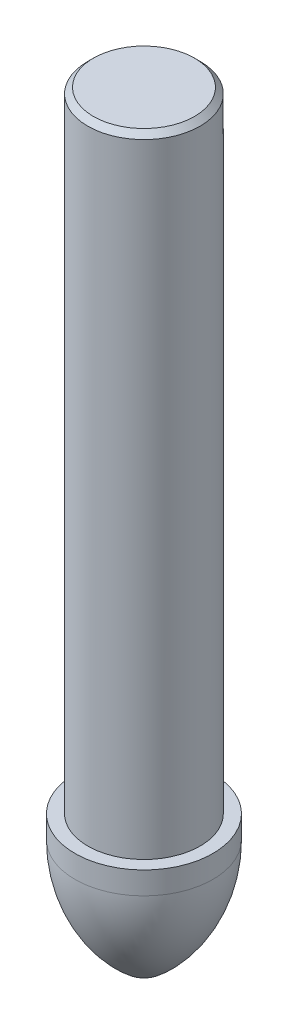
ISO-10303-21;
HEADER;
FILE_DESCRIPTION(('STEP AP214'),'2;1');
FILE_NAME('part.step','',(''),(''),'','','');
FILE_SCHEMA(('AUTOMOTIVE_DESIGN { 1 0 10303 214 1 1 1 1 }'));
ENDSEC;
DATA;
#1=APPLICATION_CONTEXT('core data for automotive mechanical design processes');
#2=APPLICATION_PROTOCOL_DEFINITION('international standard','automotive_design',2000,#1);
#3=PRODUCT_CONTEXT('',#1,'mechanical');
#4=PRODUCT('Part','Part','',(#3));
#5=PRODUCT_RELATED_PRODUCT_CATEGORY('part','',(#4));
#6=PRODUCT_DEFINITION_FORMATION('','',#4);
#7=PRODUCT_DEFINITION_CONTEXT('part definition',#1,'design');
#8=PRODUCT_DEFINITION('design','',#6,#7);
#9=PRODUCT_DEFINITION_SHAPE('','',#8);
#10=(LENGTH_UNIT() NAMED_UNIT(*) SI_UNIT(.MILLI.,.METRE.));
#11=(NAMED_UNIT(*) PLANE_ANGLE_UNIT() SI_UNIT($,.RADIAN.));
#12=(NAMED_UNIT(*) SI_UNIT($,.STERADIAN.) SOLID_ANGLE_UNIT());
#13=UNCERTAINTY_MEASURE_WITH_UNIT(LENGTH_MEASURE(1.E-05),#10,'distance_accuracy_value','');
#14=(GEOMETRIC_REPRESENTATION_CONTEXT(3) GLOBAL_UNCERTAINTY_ASSIGNED_CONTEXT((#13)) GLOBAL_UNIT_ASSIGNED_CONTEXT((#10,
#11,#12)) REPRESENTATION_CONTEXT('',''));
#15=CARTESIAN_POINT('',(0.,0.,0.));
#16=DIRECTION('',(0.,0.,1.));
#17=DIRECTION('',(1.,0.,0.));
#18=AXIS2_PLACEMENT_3D('',#15,#16,#17);
#19=CARTESIAN_POINT('',(0.,-32.8062054595095,0.));
#20=DIRECTION('',(0.,1.,0.));
#21=DIRECTION('',(-1.,0.,0.));
#22=AXIS2_PLACEMENT_3D('',#19,#20,#21);
#23=SPHERICAL_SURFACE('',#22,1.25);
#24=CARTESIAN_POINT('',(0.,-33.7791618653146,0.));
#25=DIRECTION('',(0.,1.,0.));
#26=DIRECTION('',(-1.,0.,0.));
#27=AXIS2_PLACEMENT_3D('',#24,#25,#26);
#28=CIRCLE('',#27,0.784764826175875);
#29=CARTESIAN_POINT('',(-0.784764826175871,-33.7791618653146,0.));
#30=VERTEX_POINT('',#29);
#31=EDGE_CURVE('E57',#30,#30,#28,.T.);
#32=ORIENTED_EDGE('',*,*,#31,.F.);
#33=EDGE_LOOP('',(#32));
#34=FACE_BOUND('',#33,.T.);
#35=ADVANCED_FACE('F45',(#34),#23,.T.);
#36=CARTESIAN_POINT('',(0.,-29.,0.));
#37=DIRECTION('',(0.,1.,0.));
#38=DIRECTION('',(-1.,0.,0.));
#39=AXIS2_PLACEMENT_3D('',#36,#37,#38);
#40=DEGENERATE_TOROIDAL_SURFACE('',#39,3.07,6.14,.F.);
#41=CARTESIAN_POINT('',(0.,-29.,0.));
#42=DIRECTION('',(0.,1.,0.));
#43=DIRECTION('',(-1.,0.,0.));
#44=AXIS2_PLACEMENT_3D('',#41,#42,#43);
#45=CIRCLE('',#44,3.07);
#46=CARTESIAN_POINT('',(-3.07,-29.,0.));
#47=VERTEX_POINT('',#46);
#48=EDGE_CURVE('E61',#47,#47,#45,.T.);
#49=ORIENTED_EDGE('',*,*,#48,.F.);
#50=EDGE_LOOP('',(#49));
#51=FACE_BOUND('',#50,.T.);
#52=ORIENTED_EDGE('',*,*,#31,.T.);
#53=EDGE_LOOP('',(#52));
#54=FACE_BOUND('',#53,.T.);
#55=ADVANCED_FACE('F84',(#51,#54),#40,.F.);
#56=CARTESIAN_POINT('',(0.,0.,0.));
#57=DIRECTION('',(0.,1.,0.));
#58=DIRECTION('',(-1.,0.,0.));
#59=AXIS2_PLACEMENT_3D('',#56,#57,#58);
#60=CYLINDRICAL_SURFACE('',#59,3.07);
#61=CARTESIAN_POINT('',(0.,-28.,0.));
#62=DIRECTION('',(0.,1.,0.));
#63=DIRECTION('',(-1.,0.,0.));
#64=AXIS2_PLACEMENT_3D('',#61,#62,#63);
#65=CIRCLE('',#64,3.07);
#66=CARTESIAN_POINT('',(-3.07,-28.,0.));
#67=VERTEX_POINT('',#66);
#68=EDGE_CURVE('E66',#67,#67,#65,.T.);
#69=ORIENTED_EDGE('',*,*,#68,.F.);
#70=EDGE_LOOP('',(#69));
#71=FACE_BOUND('',#70,.T.);
#72=ORIENTED_EDGE('',*,*,#48,.T.);
#73=EDGE_LOOP('',(#72));
#74=FACE_BOUND('',#73,.T.);
#75=ADVANCED_FACE('F78',(#71,#74),#60,.T.);
#76=CARTESIAN_POINT('',(2.5,-28.,0.));
#77=DIRECTION('',(0.,-1.,0.));
#78=DIRECTION('',(1.,0.,0.));
#79=AXIS2_PLACEMENT_3D('',#76,#77,#78);
#80=PLANE('',#79);
#81=CARTESIAN_POINT('',(0.,-28.,0.));
#82=DIRECTION('',(0.,1.,0.));
#83=DIRECTION('',(-1.,0.,0.));
#84=AXIS2_PLACEMENT_3D('',#81,#82,#83);
#85=CIRCLE('',#84,2.5);
#86=CARTESIAN_POINT('',(-2.5,-28.,0.));
#87=VERTEX_POINT('',#86);
#88=EDGE_CURVE('E69',#87,#87,#85,.T.);
#89=ORIENTED_EDGE('',*,*,#88,.F.);
#90=EDGE_LOOP('',(#89));
#91=FACE_BOUND('',#90,.T.);
#92=ORIENTED_EDGE('',*,*,#68,.T.);
#93=EDGE_LOOP('',(#92));
#94=FACE_BOUND('',#93,.T.);
#95=ADVANCED_FACE('F75',(#91,#94),#80,.F.);
#96=CARTESIAN_POINT('',(0.,0.,0.));
#97=DIRECTION('',(0.,1.,0.));
#98=DIRECTION('',(-1.,0.,0.));
#99=AXIS2_PLACEMENT_3D('',#96,#97,#98);
#100=CYLINDRICAL_SURFACE('',#99,2.5);
#101=CARTESIAN_POINT('',(0.,-0.250000000000004,0.));
#102=DIRECTION('',(0.,-1.,0.));
#103=DIRECTION('',(1.,0.,0.));
#104=AXIS2_PLACEMENT_3D('',#101,#102,#103);
#105=CIRCLE('',#104,2.5);
#106=CARTESIAN_POINT('',(2.5,-0.250000000000004,0.));
#107=VERTEX_POINT('',#106);
#108=EDGE_CURVE('E10',#107,#107,#105,.T.);
#109=ORIENTED_EDGE('',*,*,#108,.T.);
#110=EDGE_LOOP('',(#109));
#111=FACE_BOUND('',#110,.T.);
#112=ORIENTED_EDGE('',*,*,#88,.T.);
#113=EDGE_LOOP('',(#112));
#114=FACE_BOUND('',#113,.T.);
#115=ADVANCED_FACE('F73',(#111,#114),#100,.T.);
#116=CARTESIAN_POINT('',(0.,0.,0.));
#117=DIRECTION('',(0.,-1.,0.));
#118=DIRECTION('',(1.,0.,0.));
#119=AXIS2_PLACEMENT_3D('',#116,#117,#118);
#120=PLANE('',#119);
#121=CARTESIAN_POINT('',(0.,0.,0.));
#122=DIRECTION('',(0.,-1.,0.));
#123=DIRECTION('',(1.,0.,0.));
#124=AXIS2_PLACEMENT_3D('',#121,#122,#123);
#125=CIRCLE('',#124,2.25);
#126=CARTESIAN_POINT('',(2.25,0.,0.));
#127=VERTEX_POINT('',#126);
#128=EDGE_CURVE('E53',#127,#127,#125,.F.);
#129=ORIENTED_EDGE('',*,*,#128,.T.);
#130=EDGE_LOOP('',(#129));
#131=FACE_BOUND('',#130,.T.);
#132=ADVANCED_FACE('F99',(#131),#120,.F.);
#133=CARTESIAN_POINT('',(0.,0.,0.));
#134=DIRECTION('',(0.,-1.,0.));
#135=DIRECTION('',(1.,0.,0.));
#136=AXIS2_PLACEMENT_3D('',#133,#134,#135);
#137=CONICAL_SURFACE('',#136,2.25,0.785398163397445);
#138=ORIENTED_EDGE('',*,*,#108,.F.);
#139=EDGE_LOOP('',(#138));
#140=FACE_BOUND('',#139,.T.);
#141=ORIENTED_EDGE('',*,*,#128,.F.);
#142=EDGE_LOOP('',(#141));
#143=FACE_BOUND('',#142,.T.);
#144=ADVANCED_FACE('F48',(#140,#143),#137,.T.);
#145=CLOSED_SHELL('',(#35,#55,#75,#95,#115,#132,#144));
#146=MANIFOLD_SOLID_BREP('B2',#145);
#147=ADVANCED_BREP_SHAPE_REPRESENTATION('',(#18,#146),#14);
#148=SHAPE_DEFINITION_REPRESENTATION(#9,#147);
ENDSEC;
END-ISO-10303-21;
